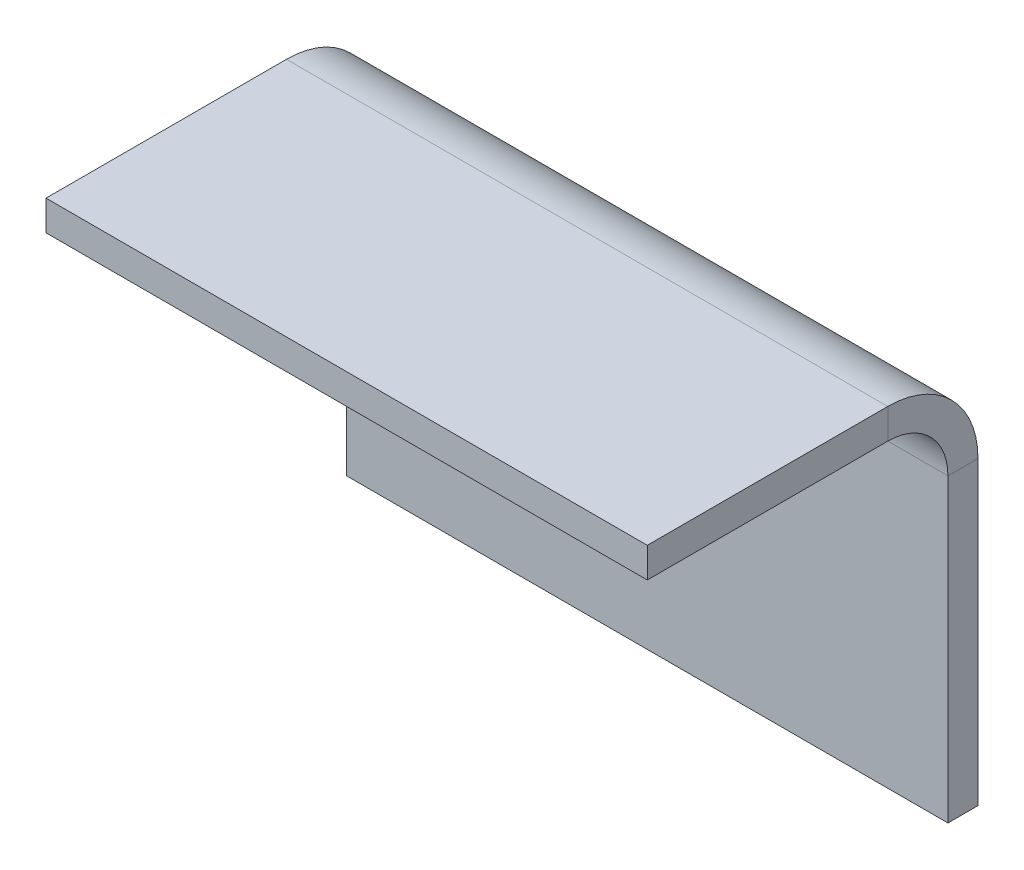
ISO-10303-21;
HEADER;
FILE_DESCRIPTION(('STEP AP214'),'2;1');
FILE_NAME('part.step','',(''),(''),'','','');
FILE_SCHEMA(('AUTOMOTIVE_DESIGN { 1 0 10303 214 1 1 1 1 }'));
ENDSEC;
DATA;
#1=APPLICATION_CONTEXT('core data for automotive mechanical design processes');
#2=APPLICATION_PROTOCOL_DEFINITION('international standard','automotive_design',2000,#1);
#3=PRODUCT_CONTEXT('',#1,'mechanical');
#4=PRODUCT('Part','Part','',(#3));
#5=PRODUCT_RELATED_PRODUCT_CATEGORY('part','',(#4));
#6=PRODUCT_DEFINITION_FORMATION('','',#4);
#7=PRODUCT_DEFINITION_CONTEXT('part definition',#1,'design');
#8=PRODUCT_DEFINITION('design','',#6,#7);
#9=PRODUCT_DEFINITION_SHAPE('','',#8);
#10=(LENGTH_UNIT() NAMED_UNIT(*) SI_UNIT(.MILLI.,.METRE.));
#11=(NAMED_UNIT(*) PLANE_ANGLE_UNIT() SI_UNIT($,.RADIAN.));
#12=(NAMED_UNIT(*) SI_UNIT($,.STERADIAN.) SOLID_ANGLE_UNIT());
#13=UNCERTAINTY_MEASURE_WITH_UNIT(LENGTH_MEASURE(1.E-05),#10,'distance_accuracy_value','');
#14=(GEOMETRIC_REPRESENTATION_CONTEXT(3) GLOBAL_UNCERTAINTY_ASSIGNED_CONTEXT((#13)) GLOBAL_UNIT_ASSIGNED_CONTEXT((#10,
#11,#12)) REPRESENTATION_CONTEXT('',''));
#15=CARTESIAN_POINT('',(0.,0.,0.));
#16=DIRECTION('',(0.,0.,1.));
#17=DIRECTION('',(1.,0.,0.));
#18=AXIS2_PLACEMENT_3D('',#15,#16,#17);
#19=CARTESIAN_POINT('',(0.,0.,-1.));
#20=DIRECTION('',(-1.,0.,0.));
#21=DIRECTION('',(0.,0.,1.));
#22=AXIS2_PLACEMENT_3D('',#19,#20,#21);
#23=PLANE('',#22);
#24=DIRECTION('',(0.,-1.,0.));
#25=VECTOR('',#24,1.);
#26=CARTESIAN_POINT('',(0.,0.,0.));
#27=LINE('',#26,#25);
#28=CARTESIAN_POINT('',(0.,10.,0.));
#29=VERTEX_POINT('',#28);
#30=CARTESIAN_POINT('',(0.,0.,0.));
#31=VERTEX_POINT('',#30);
#32=EDGE_CURVE('E105',#29,#31,#27,.T.);
#33=ORIENTED_EDGE('',*,*,#32,.F.);
#34=DIRECTION('',(0.,0.,1.));
#35=VECTOR('',#34,1.);
#36=CARTESIAN_POINT('',(0.,10.,-1.));
#37=LINE('',#36,#35);
#38=CARTESIAN_POINT('',(0.,10.,-1.));
#39=VERTEX_POINT('',#38);
#40=EDGE_CURVE('E13',#39,#29,#37,.T.);
#41=ORIENTED_EDGE('',*,*,#40,.F.);
#42=DIRECTION('',(0.,-1.,0.));
#43=VECTOR('',#42,1.);
#44=CARTESIAN_POINT('',(0.,0.,-1.));
#45=LINE('',#44,#43);
#46=CARTESIAN_POINT('',(0.,0.,-1.));
#47=VERTEX_POINT('',#46);
#48=EDGE_CURVE('E191',#39,#47,#45,.T.);
#49=ORIENTED_EDGE('',*,*,#48,.T.);
#50=DIRECTION('',(0.,0.,1.));
#51=VECTOR('',#50,1.);
#52=CARTESIAN_POINT('',(0.,0.,-1.));
#53=LINE('',#52,#51);
#54=EDGE_CURVE('E70',#47,#31,#53,.T.);
#55=ORIENTED_EDGE('',*,*,#54,.T.);
#56=EDGE_LOOP('',(#33,#41,#49,#55));
#57=FACE_BOUND('',#56,.T.);
#58=ADVANCED_FACE('F65',(#57),#23,.T.);
#59=CARTESIAN_POINT('',(20.,0.,-1.));
#60=DIRECTION('',(1.,0.,0.));
#61=DIRECTION('',(0.,0.,-1.));
#62=AXIS2_PLACEMENT_3D('',#59,#60,#61);
#63=PLANE('',#62);
#64=DIRECTION('',(0.,1.,0.));
#65=VECTOR('',#64,1.);
#66=CARTESIAN_POINT('',(20.,0.,0.));
#67=LINE('',#66,#65);
#68=CARTESIAN_POINT('',(20.,0.,0.));
#69=VERTEX_POINT('',#68);
#70=CARTESIAN_POINT('',(20.,10.,0.));
#71=VERTEX_POINT('',#70);
#72=EDGE_CURVE('E202',#69,#71,#67,.T.);
#73=ORIENTED_EDGE('',*,*,#72,.F.);
#74=DIRECTION('',(0.,0.,1.));
#75=VECTOR('',#74,1.);
#76=CARTESIAN_POINT('',(20.,0.,-1.));
#77=LINE('',#76,#75);
#78=CARTESIAN_POINT('',(20.,0.,-1.));
#79=VERTEX_POINT('',#78);
#80=EDGE_CURVE('E208',#79,#69,#77,.T.);
#81=ORIENTED_EDGE('',*,*,#80,.F.);
#82=DIRECTION('',(0.,1.,0.));
#83=VECTOR('',#82,1.);
#84=CARTESIAN_POINT('',(20.,0.,-1.));
#85=LINE('',#84,#83);
#86=CARTESIAN_POINT('',(20.,10.,-1.));
#87=VERTEX_POINT('',#86);
#88=EDGE_CURVE('E82',#79,#87,#85,.T.);
#89=ORIENTED_EDGE('',*,*,#88,.T.);
#90=DIRECTION('',(0.,0.,1.));
#91=VECTOR('',#90,1.);
#92=CARTESIAN_POINT('',(20.,10.,-1.));
#93=LINE('',#92,#91);
#94=EDGE_CURVE('E71',#87,#71,#93,.T.);
#95=ORIENTED_EDGE('',*,*,#94,.T.);
#96=EDGE_LOOP('',(#73,#81,#89,#95));
#97=FACE_BOUND('',#96,.T.);
#98=ADVANCED_FACE('F244',(#97),#63,.T.);
#99=CARTESIAN_POINT('',(0.,0.,-1.));
#100=DIRECTION('',(0.,-1.,0.));
#101=DIRECTION('',(0.,0.,-1.));
#102=AXIS2_PLACEMENT_3D('',#99,#100,#101);
#103=PLANE('',#102);
#104=DIRECTION('',(1.,0.,0.));
#105=VECTOR('',#104,1.);
#106=CARTESIAN_POINT('',(0.,0.,0.));
#107=LINE('',#106,#105);
#108=EDGE_CURVE('E205',#31,#69,#107,.T.);
#109=ORIENTED_EDGE('',*,*,#108,.F.);
#110=ORIENTED_EDGE('',*,*,#54,.F.);
#111=DIRECTION('',(1.,0.,0.));
#112=VECTOR('',#111,1.);
#113=CARTESIAN_POINT('',(0.,0.,-1.));
#114=LINE('',#113,#112);
#115=EDGE_CURVE('E193',#47,#79,#114,.T.);
#116=ORIENTED_EDGE('',*,*,#115,.T.);
#117=ORIENTED_EDGE('',*,*,#80,.T.);
#118=EDGE_LOOP('',(#109,#110,#116,#117));
#119=FACE_BOUND('',#118,.T.);
#120=ADVANCED_FACE('F207',(#119),#103,.T.);
#121=CARTESIAN_POINT('',(0.,0.,-1.));
#122=DIRECTION('',(0.,0.,-1.));
#123=DIRECTION('',(-1.,0.,0.));
#124=AXIS2_PLACEMENT_3D('',#121,#122,#123);
#125=PLANE('',#124);
#126=ORIENTED_EDGE('',*,*,#48,.F.);
#127=DIRECTION('',(-1.,0.,0.));
#128=VECTOR('',#127,1.);
#129=CARTESIAN_POINT('',(0.,10.,-1.));
#130=LINE('',#129,#128);
#131=EDGE_CURVE('E196',#87,#39,#130,.T.);
#132=ORIENTED_EDGE('',*,*,#131,.F.);
#133=ORIENTED_EDGE('',*,*,#88,.F.);
#134=ORIENTED_EDGE('',*,*,#115,.F.);
#135=EDGE_LOOP('',(#126,#132,#133,#134));
#136=FACE_BOUND('',#135,.T.);
#137=ADVANCED_FACE('F236',(#136),#125,.T.);
#138=CARTESIAN_POINT('',(0.,0.,0.));
#139=DIRECTION('',(0.,0.,-1.));
#140=DIRECTION('',(-1.,0.,0.));
#141=AXIS2_PLACEMENT_3D('',#138,#139,#140);
#142=PLANE('',#141);
#143=ORIENTED_EDGE('',*,*,#32,.T.);
#144=ORIENTED_EDGE('',*,*,#108,.T.);
#145=ORIENTED_EDGE('',*,*,#72,.T.);
#146=DIRECTION('',(-1.,0.,0.));
#147=VECTOR('',#146,1.);
#148=CARTESIAN_POINT('',(0.,10.,0.));
#149=LINE('',#148,#147);
#150=EDGE_CURVE('E195',#71,#29,#149,.T.);
#151=ORIENTED_EDGE('',*,*,#150,.T.);
#152=EDGE_LOOP('',(#143,#144,#145,#151));
#153=FACE_BOUND('',#152,.T.);
#154=ADVANCED_FACE('F211',(#153),#142,.F.);
#155=CARTESIAN_POINT('',(20.,10.,2.));
#156=DIRECTION('',(1.,0.,0.));
#157=DIRECTION('',(0.,0.,-1.));
#158=AXIS2_PLACEMENT_3D('',#155,#156,#157);
#159=PLANE('',#158);
#160=DIRECTION('',(0.,-1.,0.));
#161=VECTOR('',#160,1.);
#162=CARTESIAN_POINT('',(20.,13.,1.99999999999998));
#163=LINE('',#162,#161);
#164=CARTESIAN_POINT('',(20.,12.,1.99999999999999));
#165=VERTEX_POINT('',#164);
#166=CARTESIAN_POINT('',(20.,13.,1.99999999999998));
#167=VERTEX_POINT('',#166);
#168=EDGE_CURVE('E165',#165,#167,#163,.F.);
#169=ORIENTED_EDGE('',*,*,#168,.F.);
#170=CARTESIAN_POINT('',(20.,10.,2.));
#171=DIRECTION('',(-1.,0.,0.));
#172=DIRECTION('',(0.,0.,1.));
#173=AXIS2_PLACEMENT_3D('',#170,#171,#172);
#174=CIRCLE('',#173,2.);
#175=EDGE_CURVE('E183',#71,#165,#174,.F.);
#176=ORIENTED_EDGE('',*,*,#175,.F.);
#177=ORIENTED_EDGE('',*,*,#94,.F.);
#178=CARTESIAN_POINT('',(20.,10.,2.));
#179=DIRECTION('',(-1.,0.,0.));
#180=DIRECTION('',(0.,0.,1.));
#181=AXIS2_PLACEMENT_3D('',#178,#179,#180);
#182=CIRCLE('',#181,3.);
#183=EDGE_CURVE('E179',#87,#167,#182,.F.);
#184=ORIENTED_EDGE('',*,*,#183,.T.);
#185=EDGE_LOOP('',(#169,#176,#177,#184));
#186=FACE_BOUND('',#185,.T.);
#187=ADVANCED_FACE('F226',(#186),#159,.T.);
#188=CARTESIAN_POINT('',(0.,10.,2.));
#189=DIRECTION('',(1.,0.,0.));
#190=DIRECTION('',(0.,0.,-1.));
#191=AXIS2_PLACEMENT_3D('',#188,#189,#190);
#192=PLANE('',#191);
#193=CARTESIAN_POINT('',(0.,10.,2.));
#194=DIRECTION('',(-1.,0.,0.));
#195=DIRECTION('',(0.,0.,1.));
#196=AXIS2_PLACEMENT_3D('',#193,#194,#195);
#197=CIRCLE('',#196,2.);
#198=CARTESIAN_POINT('',(0.,12.,1.99999999999999));
#199=VERTEX_POINT('',#198);
#200=EDGE_CURVE('E187',#199,#29,#197,.T.);
#201=ORIENTED_EDGE('',*,*,#200,.F.);
#202=DIRECTION('',(0.,-1.,0.));
#203=VECTOR('',#202,1.);
#204=CARTESIAN_POINT('',(0.,12.,1.99999999999999));
#205=LINE('',#204,#203);
#206=CARTESIAN_POINT('',(0.,13.,1.99999999999998));
#207=VERTEX_POINT('',#206);
#208=EDGE_CURVE('E172',#199,#207,#205,.F.);
#209=ORIENTED_EDGE('',*,*,#208,.T.);
#210=CARTESIAN_POINT('',(0.,10.,2.));
#211=DIRECTION('',(-1.,0.,0.));
#212=DIRECTION('',(0.,0.,1.));
#213=AXIS2_PLACEMENT_3D('',#210,#211,#212);
#214=CIRCLE('',#213,3.);
#215=EDGE_CURVE('E185',#207,#39,#214,.T.);
#216=ORIENTED_EDGE('',*,*,#215,.T.);
#217=ORIENTED_EDGE('',*,*,#40,.T.);
#218=EDGE_LOOP('',(#201,#209,#216,#217));
#219=FACE_BOUND('',#218,.T.);
#220=ADVANCED_FACE('F220',(#219),#192,.F.);
#221=CARTESIAN_POINT('',(0.,10.,2.));
#222=DIRECTION('',(-1.,0.,0.));
#223=DIRECTION('',(0.,1.,0.));
#224=AXIS2_PLACEMENT_3D('',#221,#222,#223);
#225=CYLINDRICAL_SURFACE('',#224,3.);
#226=ORIENTED_EDGE('',*,*,#131,.T.);
#227=ORIENTED_EDGE('',*,*,#215,.F.);
#228=DIRECTION('',(-1.,0.,0.));
#229=VECTOR('',#228,1.);
#230=CARTESIAN_POINT('',(20.,13.,1.99999999999998));
#231=LINE('',#230,#229);
#232=EDGE_CURVE('E173',#207,#167,#231,.F.);
#233=ORIENTED_EDGE('',*,*,#232,.T.);
#234=ORIENTED_EDGE('',*,*,#183,.F.);
#235=EDGE_LOOP('',(#226,#227,#233,#234));
#236=FACE_BOUND('',#235,.T.);
#237=ADVANCED_FACE('F227',(#236),#225,.T.);
#238=CARTESIAN_POINT('',(0.,10.,2.));
#239=DIRECTION('',(-1.,0.,0.));
#240=DIRECTION('',(0.,1.,0.));
#241=AXIS2_PLACEMENT_3D('',#238,#239,#240);
#242=CYLINDRICAL_SURFACE('',#241,2.);
#243=ORIENTED_EDGE('',*,*,#150,.F.);
#244=ORIENTED_EDGE('',*,*,#175,.T.);
#245=DIRECTION('',(-1.,0.,0.));
#246=VECTOR('',#245,1.);
#247=CARTESIAN_POINT('',(20.,12.,1.99999999999999));
#248=LINE('',#247,#246);
#249=EDGE_CURVE('E178',#165,#199,#248,.T.);
#250=ORIENTED_EDGE('',*,*,#249,.T.);
#251=ORIENTED_EDGE('',*,*,#200,.T.);
#252=EDGE_LOOP('',(#243,#244,#250,#251));
#253=FACE_BOUND('',#252,.T.);
#254=ADVANCED_FACE('F218',(#253),#242,.F.);
#255=CARTESIAN_POINT('',(20.,13.,0.));
#256=DIRECTION('',(-1.,0.,0.));
#257=DIRECTION('',(0.,0.,1.));
#258=AXIS2_PLACEMENT_3D('',#255,#256,#257);
#259=PLANE('',#258);
#260=ORIENTED_EDGE('',*,*,#168,.T.);
#261=DIRECTION('',(0.,0.,-1.));
#262=VECTOR('',#261,1.);
#263=CARTESIAN_POINT('',(20.,13.,0.));
#264=LINE('',#263,#262);
#265=CARTESIAN_POINT('',(20.,13.0000000000001,9.99999999999999));
#266=VERTEX_POINT('',#265);
#267=EDGE_CURVE('E141',#266,#167,#264,.T.);
#268=ORIENTED_EDGE('',*,*,#267,.F.);
#269=DIRECTION('',(0.,-1.,0.));
#270=VECTOR('',#269,1.);
#271=CARTESIAN_POINT('',(20.,13.0000000000001,9.99999999999999));
#272=LINE('',#271,#270);
#273=CARTESIAN_POINT('',(20.,12.0000000000001,10.));
#274=VERTEX_POINT('',#273);
#275=EDGE_CURVE('E149',#266,#274,#272,.T.);
#276=ORIENTED_EDGE('',*,*,#275,.T.);
#277=DIRECTION('',(0.,0.,1.));
#278=VECTOR('',#277,1.);
#279=CARTESIAN_POINT('',(20.,12.,0.));
#280=LINE('',#279,#278);
#281=EDGE_CURVE('E166',#274,#165,#280,.F.);
#282=ORIENTED_EDGE('',*,*,#281,.T.);
#283=EDGE_LOOP('',(#260,#268,#276,#282));
#284=FACE_BOUND('',#283,.T.);
#285=ADVANCED_FACE('F161',(#284),#259,.F.);
#286=CARTESIAN_POINT('',(0.,13.,0.));
#287=DIRECTION('',(1.,0.,0.));
#288=DIRECTION('',(0.,0.,-1.));
#289=AXIS2_PLACEMENT_3D('',#286,#287,#288);
#290=PLANE('',#289);
#291=ORIENTED_EDGE('',*,*,#208,.F.);
#292=DIRECTION('',(0.,0.,-1.));
#293=VECTOR('',#292,1.);
#294=CARTESIAN_POINT('',(0.,12.,0.));
#295=LINE('',#294,#293);
#296=CARTESIAN_POINT('',(0.,12.0000000000001,10.));
#297=VERTEX_POINT('',#296);
#298=EDGE_CURVE('E164',#199,#297,#295,.F.);
#299=ORIENTED_EDGE('',*,*,#298,.T.);
#300=DIRECTION('',(0.,-1.,0.));
#301=VECTOR('',#300,1.);
#302=CARTESIAN_POINT('',(0.,13.0000000000001,9.99999999999999));
#303=LINE('',#302,#301);
#304=CARTESIAN_POINT('',(0.,13.0000000000001,9.99999999999999));
#305=VERTEX_POINT('',#304);
#306=EDGE_CURVE('E158',#305,#297,#303,.T.);
#307=ORIENTED_EDGE('',*,*,#306,.F.);
#308=DIRECTION('',(0.,0.,1.));
#309=VECTOR('',#308,1.);
#310=CARTESIAN_POINT('',(0.,13.,0.));
#311=LINE('',#310,#309);
#312=EDGE_CURVE('E144',#207,#305,#311,.T.);
#313=ORIENTED_EDGE('',*,*,#312,.F.);
#314=EDGE_LOOP('',(#291,#299,#307,#313));
#315=FACE_BOUND('',#314,.T.);
#316=ADVANCED_FACE('F223',(#315),#290,.F.);
#317=CARTESIAN_POINT('',(0.,13.,0.));
#318=DIRECTION('',(0.,-1.,0.));
#319=DIRECTION('',(0.,0.,-1.));
#320=AXIS2_PLACEMENT_3D('',#317,#318,#319);
#321=PLANE('',#320);
#322=ORIENTED_EDGE('',*,*,#232,.F.);
#323=ORIENTED_EDGE('',*,*,#312,.T.);
#324=DIRECTION('',(1.,0.,0.));
#325=VECTOR('',#324,1.);
#326=CARTESIAN_POINT('',(0.,13.0000000000001,9.99999999999999));
#327=LINE('',#326,#325);
#328=EDGE_CURVE('E139',#305,#266,#327,.T.);
#329=ORIENTED_EDGE('',*,*,#328,.T.);
#330=ORIENTED_EDGE('',*,*,#267,.T.);
#331=EDGE_LOOP('',(#322,#323,#329,#330));
#332=FACE_BOUND('',#331,.T.);
#333=ADVANCED_FACE('F143',(#332),#321,.F.);
#334=CARTESIAN_POINT('',(0.,12.,0.));
#335=DIRECTION('',(0.,-1.,0.));
#336=DIRECTION('',(0.,0.,-1.));
#337=AXIS2_PLACEMENT_3D('',#334,#335,#336);
#338=PLANE('',#337);
#339=ORIENTED_EDGE('',*,*,#298,.F.);
#340=ORIENTED_EDGE('',*,*,#249,.F.);
#341=ORIENTED_EDGE('',*,*,#281,.F.);
#342=DIRECTION('',(-1.,0.,0.));
#343=VECTOR('',#342,1.);
#344=CARTESIAN_POINT('',(20.,12.0000000000001,10.));
#345=LINE('',#344,#343);
#346=EDGE_CURVE('E152',#297,#274,#345,.F.);
#347=ORIENTED_EDGE('',*,*,#346,.F.);
#348=EDGE_LOOP('',(#339,#340,#341,#347));
#349=FACE_BOUND('',#348,.T.);
#350=ADVANCED_FACE('F224',(#349),#338,.T.);
#351=CARTESIAN_POINT('',(20.,13.0000000000001,9.99999999999999));
#352=DIRECTION('',(0.,0.,-1.));
#353=DIRECTION('',(0.,1.,0.));
#354=AXIS2_PLACEMENT_3D('',#351,#352,#353);
#355=PLANE('',#354);
#356=ORIENTED_EDGE('',*,*,#346,.T.);
#357=ORIENTED_EDGE('',*,*,#275,.F.);
#358=ORIENTED_EDGE('',*,*,#328,.F.);
#359=ORIENTED_EDGE('',*,*,#306,.T.);
#360=EDGE_LOOP('',(#356,#357,#358,#359));
#361=FACE_BOUND('',#360,.T.);
#362=ADVANCED_FACE('F155',(#361),#355,.F.);
#363=CLOSED_SHELL('',(#58,#98,#120,#137,#154,#187,#220,#237,#254,#285,#316,#333,#350,#362));
#364=MANIFOLD_SOLID_BREP('B2',#363);
#365=ADVANCED_BREP_SHAPE_REPRESENTATION('',(#18,#364),#14);
#366=SHAPE_DEFINITION_REPRESENTATION(#9,#365);
ENDSEC;
END-ISO-10303-21;
